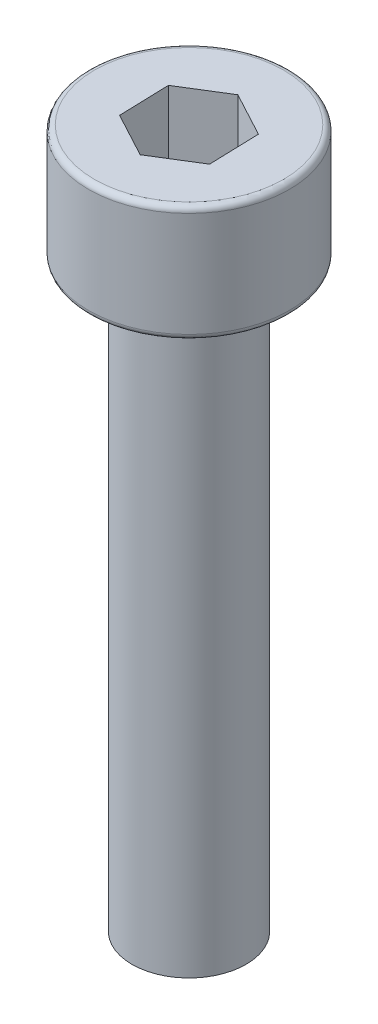
ISO-10303-21;
HEADER;
FILE_DESCRIPTION(('STEP AP214'),'2;1');
FILE_NAME('part.step','',(''),(''),'','','');
FILE_SCHEMA(('AUTOMOTIVE_DESIGN { 1 0 10303 214 1 1 1 1 }'));
ENDSEC;
DATA;
#1=APPLICATION_CONTEXT('core data for automotive mechanical design processes');
#2=APPLICATION_PROTOCOL_DEFINITION('international standard','automotive_design',2000,#1);
#3=PRODUCT_CONTEXT('',#1,'mechanical');
#4=PRODUCT('Part','Part','',(#3));
#5=PRODUCT_RELATED_PRODUCT_CATEGORY('part','',(#4));
#6=PRODUCT_DEFINITION_FORMATION('','',#4);
#7=PRODUCT_DEFINITION_CONTEXT('part definition',#1,'design');
#8=PRODUCT_DEFINITION('design','',#6,#7);
#9=PRODUCT_DEFINITION_SHAPE('','',#8);
#10=(LENGTH_UNIT() NAMED_UNIT(*) SI_UNIT(.MILLI.,.METRE.));
#11=(NAMED_UNIT(*) PLANE_ANGLE_UNIT() SI_UNIT($,.RADIAN.));
#12=(NAMED_UNIT(*) SI_UNIT($,.STERADIAN.) SOLID_ANGLE_UNIT());
#13=UNCERTAINTY_MEASURE_WITH_UNIT(LENGTH_MEASURE(1.E-05),#10,'distance_accuracy_value','');
#14=(GEOMETRIC_REPRESENTATION_CONTEXT(3) GLOBAL_UNCERTAINTY_ASSIGNED_CONTEXT((#13)) GLOBAL_UNIT_ASSIGNED_CONTEXT((#10,
#11,#12)) REPRESENTATION_CONTEXT('',''));
#15=CARTESIAN_POINT('',(0.,0.,0.));
#16=DIRECTION('',(0.,0.,1.));
#17=DIRECTION('',(1.,0.,0.));
#18=AXIS2_PLACEMENT_3D('',#15,#16,#17);
#19=CARTESIAN_POINT('',(0.,20.,0.));
#20=DIRECTION('',(0.,-1.,0.));
#21=DIRECTION('',(0.,0.,-1.));
#22=AXIS2_PLACEMENT_3D('',#19,#20,#21);
#23=CYLINDRICAL_SURFACE('',#22,1.96);
#24=CARTESIAN_POINT('',(0.,20.,0.));
#25=DIRECTION('',(0.,1.,0.));
#26=DIRECTION('',(0.,0.,1.));
#27=AXIS2_PLACEMENT_3D('',#24,#25,#26);
#28=CIRCLE('',#27,1.96);
#29=CARTESIAN_POINT('',(0.,20.,1.96));
#30=VERTEX_POINT('',#29);
#31=EDGE_CURVE('E141',#30,#30,#28,.T.);
#32=ORIENTED_EDGE('',*,*,#31,.F.);
#33=EDGE_LOOP('',(#32));
#34=FACE_BOUND('',#33,.T.);
#35=CARTESIAN_POINT('',(0.,0.,0.));
#36=DIRECTION('',(0.,1.,0.));
#37=DIRECTION('',(0.,0.,1.));
#38=AXIS2_PLACEMENT_3D('',#35,#36,#37);
#39=CIRCLE('',#38,1.96);
#40=CARTESIAN_POINT('',(0.,0.,1.96));
#41=VERTEX_POINT('',#40);
#42=EDGE_CURVE('E135',#41,#41,#39,.T.);
#43=ORIENTED_EDGE('',*,*,#42,.T.);
#44=EDGE_LOOP('',(#43));
#45=FACE_BOUND('',#44,.T.);
#46=ADVANCED_FACE('F33',(#34,#45),#23,.T.);
#47=CARTESIAN_POINT('',(0.,0.,0.));
#48=DIRECTION('',(0.,1.,0.));
#49=DIRECTION('',(0.,0.,1.));
#50=AXIS2_PLACEMENT_3D('',#47,#48,#49);
#51=PLANE('',#50);
#52=ORIENTED_EDGE('',*,*,#42,.F.);
#53=EDGE_LOOP('',(#52));
#54=FACE_BOUND('',#53,.T.);
#55=ADVANCED_FACE('F186',(#54),#51,.F.);
#56=CARTESIAN_POINT('',(0.,24.,0.));
#57=DIRECTION('',(0.,-1.,0.));
#58=DIRECTION('',(0.,0.,-1.));
#59=AXIS2_PLACEMENT_3D('',#56,#57,#58);
#60=CYLINDRICAL_SURFACE('',#59,3.45);
#61=CARTESIAN_POINT('',(0.,23.8,0.));
#62=DIRECTION('',(0.,1.,0.));
#63=DIRECTION('',(0.,0.,1.));
#64=AXIS2_PLACEMENT_3D('',#61,#62,#63);
#65=CIRCLE('',#64,3.45);
#66=CARTESIAN_POINT('',(0.,23.8,3.45));
#67=VERTEX_POINT('',#66);
#68=EDGE_CURVE('E41',#67,#67,#65,.F.);
#69=ORIENTED_EDGE('',*,*,#68,.T.);
#70=EDGE_LOOP('',(#69));
#71=FACE_BOUND('',#70,.T.);
#72=CARTESIAN_POINT('',(0.,20.2,0.));
#73=DIRECTION('',(0.,1.,0.));
#74=DIRECTION('',(0.,0.,1.));
#75=AXIS2_PLACEMENT_3D('',#72,#73,#74);
#76=CIRCLE('',#75,3.45);
#77=CARTESIAN_POINT('',(0.,20.2,3.45));
#78=VERTEX_POINT('',#77);
#79=EDGE_CURVE('E149',#78,#78,#76,.T.);
#80=ORIENTED_EDGE('',*,*,#79,.T.);
#81=EDGE_LOOP('',(#80));
#82=FACE_BOUND('',#81,.T.);
#83=ADVANCED_FACE('F154',(#71,#82),#60,.T.);
#84=CARTESIAN_POINT('',(0.,24.,0.));
#85=DIRECTION('',(0.,1.,0.));
#86=DIRECTION('',(0.,0.,1.));
#87=AXIS2_PLACEMENT_3D('',#84,#85,#86);
#88=PLANE('',#87);
#89=CARTESIAN_POINT('',(0.,24.,0.));
#90=DIRECTION('',(0.,1.,0.));
#91=DIRECTION('',(0.,0.,1.));
#92=AXIS2_PLACEMENT_3D('',#89,#90,#91);
#93=CIRCLE('',#92,3.25);
#94=CARTESIAN_POINT('',(0.,24.,3.25));
#95=VERTEX_POINT('',#94);
#96=EDGE_CURVE('E144',#95,#95,#93,.T.);
#97=ORIENTED_EDGE('',*,*,#96,.T.);
#98=EDGE_LOOP('',(#97));
#99=FACE_BOUND('',#98,.T.);
#100=DIRECTION('',(-0.881089592049715,0.,-0.472949395582304));
#101=VECTOR('',#100,1.);
#102=CARTESIAN_POINT('',(1.47247006309858,24.,-0.912048196795801));
#103=LINE('',#102,#101);
#104=CARTESIAN_POINT('',(1.47247006309858,24.,-0.912048196795801));
#105=VERTEX_POINT('',#104);
#106=CARTESIAN_POINT('',(-0.0536218763516642,24.,-1.73122057935334));
#107=VERTEX_POINT('',#106);
#108=EDGE_CURVE('E48',#105,#107,#103,.T.);
#109=ORIENTED_EDGE('',*,*,#108,.F.);
#110=DIRECTION('',(-0.0309586047460862,0.,-0.999520667516273));
#111=VECTOR('',#110,1.);
#112=CARTESIAN_POINT('',(1.52609193945024,24.,0.819172382557543));
#113=LINE('',#112,#111);
#114=CARTESIAN_POINT('',(1.52609193945024,24.,0.819172382557543));
#115=VERTEX_POINT('',#114);
#116=EDGE_CURVE('E131',#115,#105,#113,.T.);
#117=ORIENTED_EDGE('',*,*,#116,.F.);
#118=DIRECTION('',(0.850130987303629,0.,-0.526571271933968));
#119=VECTOR('',#118,1.);
#120=CARTESIAN_POINT('',(0.053621876351664,24.,1.73122057935334));
#121=LINE('',#120,#119);
#122=CARTESIAN_POINT('',(0.053621876351664,24.,1.73122057935334));
#123=VERTEX_POINT('',#122);
#124=EDGE_CURVE('E129',#123,#115,#121,.T.);
#125=ORIENTED_EDGE('',*,*,#124,.F.);
#126=DIRECTION('',(0.881089592049715,0.,0.472949395582304));
#127=VECTOR('',#126,1.);
#128=CARTESIAN_POINT('',(-1.47247006309858,24.,0.912048196795801));
#129=LINE('',#128,#127);
#130=CARTESIAN_POINT('',(-1.47247006309858,24.,0.912048196795801));
#131=VERTEX_POINT('',#130);
#132=EDGE_CURVE('E96',#131,#123,#129,.T.);
#133=ORIENTED_EDGE('',*,*,#132,.F.);
#134=DIRECTION('',(0.030958604746086,0.,0.999520667516273));
#135=VECTOR('',#134,1.);
#136=CARTESIAN_POINT('',(-1.52609193945024,24.,-0.819172382557542));
#137=LINE('',#136,#135);
#138=CARTESIAN_POINT('',(-1.52609193945024,24.,-0.819172382557542));
#139=VERTEX_POINT('',#138);
#140=EDGE_CURVE('E125',#139,#131,#137,.T.);
#141=ORIENTED_EDGE('',*,*,#140,.F.);
#142=DIRECTION('',(-0.850130987303629,0.,0.526571271933968));
#143=VECTOR('',#142,1.);
#144=CARTESIAN_POINT('',(-0.0536218763516642,24.,-1.73122057935334));
#145=LINE('',#144,#143);
#146=EDGE_CURVE('E122',#107,#139,#145,.T.);
#147=ORIENTED_EDGE('',*,*,#146,.F.);
#148=EDGE_LOOP('',(#109,#117,#125,#133,#141,#147));
#149=FACE_BOUND('',#148,.T.);
#150=ADVANCED_FACE('F162',(#99,#149),#88,.T.);
#151=CARTESIAN_POINT('',(0.,20.,0.));
#152=DIRECTION('',(0.,1.,0.));
#153=DIRECTION('',(0.,0.,1.));
#154=AXIS2_PLACEMENT_3D('',#151,#152,#153);
#155=PLANE('',#154);
#156=CARTESIAN_POINT('',(0.,20.,0.));
#157=DIRECTION('',(0.,1.,0.));
#158=DIRECTION('',(0.,0.,1.));
#159=AXIS2_PLACEMENT_3D('',#156,#157,#158);
#160=CIRCLE('',#159,3.25);
#161=CARTESIAN_POINT('',(0.,20.,3.25));
#162=VERTEX_POINT('',#161);
#163=EDGE_CURVE('E11',#162,#162,#160,.F.);
#164=ORIENTED_EDGE('',*,*,#163,.T.);
#165=EDGE_LOOP('',(#164));
#166=FACE_BOUND('',#165,.T.);
#167=ORIENTED_EDGE('',*,*,#31,.T.);
#168=EDGE_LOOP('',(#167));
#169=FACE_BOUND('',#168,.T.);
#170=ADVANCED_FACE('F165',(#166,#169),#155,.F.);
#171=CARTESIAN_POINT('',(1.47247006309858,21.3,-0.912048196795801));
#172=DIRECTION('',(0.472949395582304,0.,-0.881089592049715));
#173=DIRECTION('',(-0.881089592049715,0.,-0.472949395582304));
#174=AXIS2_PLACEMENT_3D('',#171,#172,#173);
#175=PLANE('',#174);
#176=ORIENTED_EDGE('',*,*,#108,.T.);
#177=DIRECTION('',(0.,1.,0.));
#178=VECTOR('',#177,1.);
#179=CARTESIAN_POINT('',(-0.0536218763516642,21.3,-1.73122057935334));
#180=LINE('',#179,#178);
#181=CARTESIAN_POINT('',(-0.0536218763516642,21.3,-1.73122057935334));
#182=VERTEX_POINT('',#181);
#183=EDGE_CURVE('E78',#182,#107,#180,.T.);
#184=ORIENTED_EDGE('',*,*,#183,.F.);
#185=DIRECTION('',(-0.881089592049715,0.,-0.472949395582304));
#186=VECTOR('',#185,1.);
#187=CARTESIAN_POINT('',(1.47247006309858,21.3,-0.912048196795801));
#188=LINE('',#187,#186);
#189=CARTESIAN_POINT('',(1.47247006309858,21.3,-0.912048196795801));
#190=VERTEX_POINT('',#189);
#191=EDGE_CURVE('E133',#190,#182,#188,.T.);
#192=ORIENTED_EDGE('',*,*,#191,.F.);
#193=DIRECTION('',(0.,1.,0.));
#194=VECTOR('',#193,1.);
#195=CARTESIAN_POINT('',(1.47247006309858,21.3,-0.912048196795801));
#196=LINE('',#195,#194);
#197=EDGE_CURVE('E56',#190,#105,#196,.T.);
#198=ORIENTED_EDGE('',*,*,#197,.T.);
#199=EDGE_LOOP('',(#176,#184,#192,#198));
#200=FACE_BOUND('',#199,.T.);
#201=ADVANCED_FACE('F173',(#200),#175,.F.);
#202=CARTESIAN_POINT('',(1.52609193945024,21.3,0.819172382557543));
#203=DIRECTION('',(0.999520667516273,0.,-0.0309586047460862));
#204=DIRECTION('',(-0.0309586047460862,0.,-0.999520667516273));
#205=AXIS2_PLACEMENT_3D('',#202,#203,#204);
#206=PLANE('',#205);
#207=ORIENTED_EDGE('',*,*,#116,.T.);
#208=ORIENTED_EDGE('',*,*,#197,.F.);
#209=DIRECTION('',(-0.0309586047460862,0.,-0.999520667516273));
#210=VECTOR('',#209,1.);
#211=CARTESIAN_POINT('',(1.52609193945024,21.3,0.819172382557543));
#212=LINE('',#211,#210);
#213=CARTESIAN_POINT('',(1.52609193945024,21.3,0.819172382557543));
#214=VERTEX_POINT('',#213);
#215=EDGE_CURVE('E108',#214,#190,#212,.T.);
#216=ORIENTED_EDGE('',*,*,#215,.F.);
#217=DIRECTION('',(0.,1.,0.));
#218=VECTOR('',#217,1.);
#219=CARTESIAN_POINT('',(1.52609193945024,21.3,0.819172382557543));
#220=LINE('',#219,#218);
#221=EDGE_CURVE('E100',#214,#115,#220,.T.);
#222=ORIENTED_EDGE('',*,*,#221,.T.);
#223=EDGE_LOOP('',(#207,#208,#216,#222));
#224=FACE_BOUND('',#223,.T.);
#225=ADVANCED_FACE('F175',(#224),#206,.F.);
#226=CARTESIAN_POINT('',(0.053621876351664,21.3,1.73122057935334));
#227=DIRECTION('',(0.526571271933969,0.,0.850130987303629));
#228=DIRECTION('',(0.850130987303629,0.,-0.526571271933969));
#229=AXIS2_PLACEMENT_3D('',#226,#227,#228);
#230=PLANE('',#229);
#231=ORIENTED_EDGE('',*,*,#124,.T.);
#232=ORIENTED_EDGE('',*,*,#221,.F.);
#233=DIRECTION('',(0.850130987303629,0.,-0.526571271933968));
#234=VECTOR('',#233,1.);
#235=CARTESIAN_POINT('',(0.053621876351664,21.3,1.73122057935334));
#236=LINE('',#235,#234);
#237=CARTESIAN_POINT('',(0.053621876351664,21.3,1.73122057935334));
#238=VERTEX_POINT('',#237);
#239=EDGE_CURVE('E104',#238,#214,#236,.T.);
#240=ORIENTED_EDGE('',*,*,#239,.F.);
#241=DIRECTION('',(0.,1.,0.));
#242=VECTOR('',#241,1.);
#243=CARTESIAN_POINT('',(0.053621876351664,21.3,1.73122057935334));
#244=LINE('',#243,#242);
#245=EDGE_CURVE('E89',#238,#123,#244,.T.);
#246=ORIENTED_EDGE('',*,*,#245,.T.);
#247=EDGE_LOOP('',(#231,#232,#240,#246));
#248=FACE_BOUND('',#247,.T.);
#249=ADVANCED_FACE('F105',(#248),#230,.F.);
#250=CARTESIAN_POINT('',(-1.47247006309858,21.3,0.912048196795801));
#251=DIRECTION('',(-0.472949395582304,0.,0.881089592049715));
#252=DIRECTION('',(0.881089592049715,0.,0.472949395582305));
#253=AXIS2_PLACEMENT_3D('',#250,#251,#252);
#254=PLANE('',#253);
#255=ORIENTED_EDGE('',*,*,#132,.T.);
#256=ORIENTED_EDGE('',*,*,#245,.F.);
#257=DIRECTION('',(0.881089592049715,0.,0.472949395582304));
#258=VECTOR('',#257,1.);
#259=CARTESIAN_POINT('',(-1.47247006309858,21.3,0.912048196795801));
#260=LINE('',#259,#258);
#261=CARTESIAN_POINT('',(-1.47247006309858,21.3,0.912048196795801));
#262=VERTEX_POINT('',#261);
#263=EDGE_CURVE('E93',#262,#238,#260,.T.);
#264=ORIENTED_EDGE('',*,*,#263,.F.);
#265=DIRECTION('',(0.,1.,0.));
#266=VECTOR('',#265,1.);
#267=CARTESIAN_POINT('',(-1.47247006309858,21.3,0.912048196795801));
#268=LINE('',#267,#266);
#269=EDGE_CURVE('E101',#262,#131,#268,.T.);
#270=ORIENTED_EDGE('',*,*,#269,.T.);
#271=EDGE_LOOP('',(#255,#256,#264,#270));
#272=FACE_BOUND('',#271,.T.);
#273=ADVANCED_FACE('F91',(#272),#254,.F.);
#274=CARTESIAN_POINT('',(-1.52609193945024,21.3,-0.819172382557542));
#275=DIRECTION('',(-0.999520667516273,0.,0.030958604746086));
#276=DIRECTION('',(0.030958604746086,0.,0.999520667516273));
#277=AXIS2_PLACEMENT_3D('',#274,#275,#276);
#278=PLANE('',#277);
#279=ORIENTED_EDGE('',*,*,#140,.T.);
#280=ORIENTED_EDGE('',*,*,#269,.F.);
#281=DIRECTION('',(0.030958604746086,0.,0.999520667516273));
#282=VECTOR('',#281,1.);
#283=CARTESIAN_POINT('',(-1.52609193945024,21.3,-0.819172382557542));
#284=LINE('',#283,#282);
#285=CARTESIAN_POINT('',(-1.52609193945024,21.3,-0.819172382557542));
#286=VERTEX_POINT('',#285);
#287=EDGE_CURVE('E114',#286,#262,#284,.T.);
#288=ORIENTED_EDGE('',*,*,#287,.F.);
#289=DIRECTION('',(0.,1.,0.));
#290=VECTOR('',#289,1.);
#291=CARTESIAN_POINT('',(-1.52609193945024,21.3,-0.819172382557542));
#292=LINE('',#291,#290);
#293=EDGE_CURVE('E138',#286,#139,#292,.T.);
#294=ORIENTED_EDGE('',*,*,#293,.T.);
#295=EDGE_LOOP('',(#279,#280,#288,#294));
#296=FACE_BOUND('',#295,.T.);
#297=ADVANCED_FACE('F243',(#296),#278,.F.);
#298=CARTESIAN_POINT('',(-0.0536218763516642,21.3,-1.73122057935334));
#299=DIRECTION('',(-0.526571271933969,0.,-0.850130987303629));
#300=DIRECTION('',(-0.850130987303629,0.,0.526571271933969));
#301=AXIS2_PLACEMENT_3D('',#298,#299,#300);
#302=PLANE('',#301);
#303=ORIENTED_EDGE('',*,*,#146,.T.);
#304=ORIENTED_EDGE('',*,*,#293,.F.);
#305=DIRECTION('',(-0.850130987303629,0.,0.526571271933968));
#306=VECTOR('',#305,1.);
#307=CARTESIAN_POINT('',(-0.0536218763516642,21.3,-1.73122057935334));
#308=LINE('',#307,#306);
#309=EDGE_CURVE('E116',#182,#286,#308,.T.);
#310=ORIENTED_EDGE('',*,*,#309,.F.);
#311=ORIENTED_EDGE('',*,*,#183,.T.);
#312=EDGE_LOOP('',(#303,#304,#310,#311));
#313=FACE_BOUND('',#312,.T.);
#314=ADVANCED_FACE('F171',(#313),#302,.F.);
#315=CARTESIAN_POINT('',(0.,21.3,0.));
#316=DIRECTION('',(0.,1.,0.));
#317=DIRECTION('',(0.,0.,1.));
#318=AXIS2_PLACEMENT_3D('',#315,#316,#317);
#319=PLANE('',#318);
#320=ORIENTED_EDGE('',*,*,#191,.T.);
#321=ORIENTED_EDGE('',*,*,#309,.T.);
#322=ORIENTED_EDGE('',*,*,#287,.T.);
#323=ORIENTED_EDGE('',*,*,#263,.T.);
#324=ORIENTED_EDGE('',*,*,#239,.T.);
#325=ORIENTED_EDGE('',*,*,#215,.T.);
#326=EDGE_LOOP('',(#320,#321,#322,#323,#324,#325));
#327=FACE_BOUND('',#326,.T.);
#328=ADVANCED_FACE('F111',(#327),#319,.T.);
#329=CARTESIAN_POINT('',(0.,23.8,0.));
#330=DIRECTION('',(0.,1.,0.));
#331=DIRECTION('',(0.,0.,1.));
#332=AXIS2_PLACEMENT_3D('',#329,#330,#331);
#333=TOROIDAL_SURFACE('',#332,3.25,0.2);
#334=ORIENTED_EDGE('',*,*,#68,.F.);
#335=EDGE_LOOP('',(#334));
#336=FACE_BOUND('',#335,.T.);
#337=ORIENTED_EDGE('',*,*,#96,.F.);
#338=EDGE_LOOP('',(#337));
#339=FACE_BOUND('',#338,.T.);
#340=ADVANCED_FACE('F157',(#336,#339),#333,.T.);
#341=CARTESIAN_POINT('',(0.,20.2,0.));
#342=DIRECTION('',(0.,1.,0.));
#343=DIRECTION('',(0.,0.,1.));
#344=AXIS2_PLACEMENT_3D('',#341,#342,#343);
#345=TOROIDAL_SURFACE('',#344,3.25,0.2);
#346=ORIENTED_EDGE('',*,*,#163,.F.);
#347=EDGE_LOOP('',(#346));
#348=FACE_BOUND('',#347,.T.);
#349=ORIENTED_EDGE('',*,*,#79,.F.);
#350=EDGE_LOOP('',(#349));
#351=FACE_BOUND('',#350,.T.);
#352=ADVANCED_FACE('F35',(#348,#351),#345,.T.);
#353=CLOSED_SHELL('',(#46,#55,#83,#150,#170,#201,#225,#249,#273,#297,#314,#328,#340,#352));
#354=MANIFOLD_SOLID_BREP('B2',#353);
#355=ADVANCED_BREP_SHAPE_REPRESENTATION('',(#18,#354),#14);
#356=SHAPE_DEFINITION_REPRESENTATION(#9,#355);
ENDSEC;
END-ISO-10303-21;
